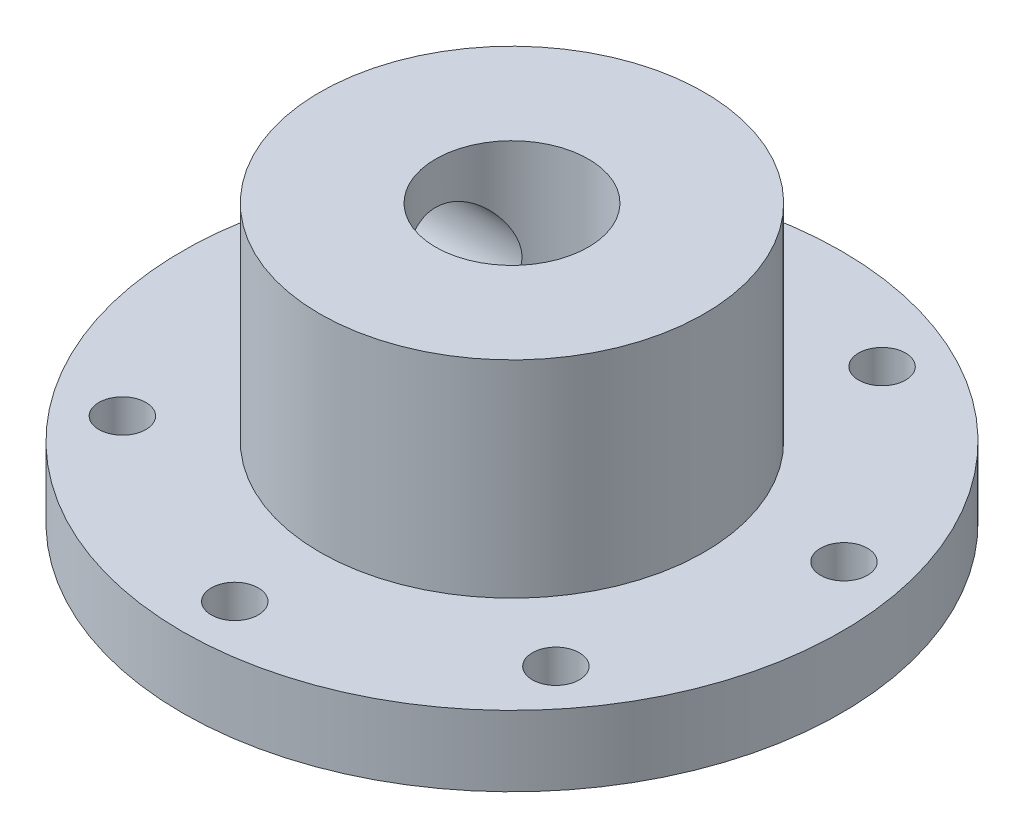
ISO-10303-21;
HEADER;
FILE_DESCRIPTION(('STEP AP214'),'2;1');
FILE_NAME('part.step','',(''),(''),'','','');
FILE_SCHEMA(('AUTOMOTIVE_DESIGN { 1 0 10303 214 1 1 1 1 }'));
ENDSEC;
DATA;
#1=APPLICATION_CONTEXT('core data for automotive mechanical design processes');
#2=APPLICATION_PROTOCOL_DEFINITION('international standard','automotive_design',2000,#1);
#3=PRODUCT_CONTEXT('',#1,'mechanical');
#4=PRODUCT('Part','Part','',(#3));
#5=PRODUCT_RELATED_PRODUCT_CATEGORY('part','',(#4));
#6=PRODUCT_DEFINITION_FORMATION('','',#4);
#7=PRODUCT_DEFINITION_CONTEXT('part definition',#1,'design');
#8=PRODUCT_DEFINITION('design','',#6,#7);
#9=PRODUCT_DEFINITION_SHAPE('','',#8);
#10=(LENGTH_UNIT() NAMED_UNIT(*) SI_UNIT(.MILLI.,.METRE.));
#11=(NAMED_UNIT(*) PLANE_ANGLE_UNIT() SI_UNIT($,.RADIAN.));
#12=(NAMED_UNIT(*) SI_UNIT($,.STERADIAN.) SOLID_ANGLE_UNIT());
#13=UNCERTAINTY_MEASURE_WITH_UNIT(LENGTH_MEASURE(1.E-05),#10,'distance_accuracy_value','');
#14=(GEOMETRIC_REPRESENTATION_CONTEXT(3) GLOBAL_UNCERTAINTY_ASSIGNED_CONTEXT((#13)) GLOBAL_UNIT_ASSIGNED_CONTEXT((#10,
#11,#12)) REPRESENTATION_CONTEXT('',''));
#15=CARTESIAN_POINT('',(0.,0.,0.));
#16=DIRECTION('',(0.,0.,1.));
#17=DIRECTION('',(1.,0.,0.));
#18=AXIS2_PLACEMENT_3D('',#15,#16,#17);
#19=CARTESIAN_POINT('',(0.,-3.,0.));
#20=DIRECTION('',(0.,1.,0.));
#21=DIRECTION('',(0.,0.,1.));
#22=AXIS2_PLACEMENT_3D('',#19,#20,#21);
#23=CYLINDRICAL_SURFACE('',#22,3.25);
#24=CARTESIAN_POINT('',(-2.07665596572952,4.5,-2.5));
#25=CARTESIAN_POINT('',(-2.07664377114661,4.44230656889235,-2.50000566138893));
#26=CARTESIAN_POINT('',(-2.07907132589907,4.38464594428914,-2.49799894449187));
#27=CARTESIAN_POINT('',(-2.08857628107896,4.2699751889259,-2.49005813593567));
#28=CARTESIAN_POINT('',(-2.09565448893797,4.21296517287137,-2.48412336229852));
#29=CARTESIAN_POINT('',(-2.12332760556506,4.04347035146273,-2.46060681756879));
#30=CARTESIAN_POINT('',(-2.15035796263175,3.9327872863159,-2.43731395322061));
#31=CARTESIAN_POINT('',(-2.22332065155218,3.69622867291958,-2.37111624666107));
#32=CARTESIAN_POINT('',(-2.27205819417528,3.572162322965,-2.32508369772081));
#33=CARTESIAN_POINT('',(-2.37836711552942,3.33583969671025,-2.21623158446787));
#34=CARTESIAN_POINT('',(-2.43594946946711,3.22359838946589,-2.15339109096638));
#35=CARTESIAN_POINT('',(-2.55531935086364,3.00823099264308,-2.0104102653358));
#36=CARTESIAN_POINT('',(-2.61717676454373,2.90541146804904,-1.92986856563048));
#37=CARTESIAN_POINT('',(-2.73873311940375,2.71290689253792,-1.75309618091663));
#38=CARTESIAN_POINT('',(-2.7984336200472,2.62321220311639,-1.65687711978355));
#39=CARTESIAN_POINT('',(-2.90898597523917,2.46211711920473,-1.45365132059631));
#40=CARTESIAN_POINT('',(-2.96010882883625,2.39009336569648,-1.34729097062166));
#41=CARTESIAN_POINT('',(-3.05277716606114,2.26194182373479,-1.12155533817299));
#42=CARTESIAN_POINT('',(-3.09433167281294,2.20579904772039,-1.00219247511261));
#43=CARTESIAN_POINT('',(-3.15902364674874,2.11932377530529,-0.771483288222962));
#44=CARTESIAN_POINT('',(-3.18399217521899,2.08637770032506,-0.661636517430967));
#45=CARTESIAN_POINT('',(-3.22256486393462,2.03571566970118,-0.436556061947239));
#46=CARTESIAN_POINT('',(-3.23617629793164,2.01798996582413,-0.32132587513333));
#47=CARTESIAN_POINT('',(-3.25089910438937,1.99882357569063,-0.0883725579162803));
#48=CARTESIAN_POINT('',(-3.25197486513434,1.99742928414114,0.0293567233028187));
#49=CARTESIAN_POINT('',(-3.24143462166312,2.01114138521723,0.263274851593331));
#50=CARTESIAN_POINT('',(-3.22981671840838,2.02625024680077,0.379463465540471));
#51=CARTESIAN_POINT('',(-3.19565973406476,2.07102109387089,0.602002036620541));
#52=CARTESIAN_POINT('',(-3.17360647721204,2.10003636445779,0.708560268431493));
#53=CARTESIAN_POINT('',(-3.12039277546372,2.17085942943099,0.914884653182125));
#54=CARTESIAN_POINT('',(-3.08923024332802,2.21267015578795,1.01464924300416));
#55=CARTESIAN_POINT('',(-3.01603831816756,2.31247602958689,1.21600323619508));
#56=CARTESIAN_POINT('',(-2.97321122037237,2.37171000845147,1.3166832277397));
#57=CARTESIAN_POINT('',(-2.88142020418204,2.50194668096873,1.50701840525063));
#58=CARTESIAN_POINT('',(-2.83245171173749,2.57295815922974,1.59666527421733));
#59=CARTESIAN_POINT('',(-2.72084272270924,2.74068574890235,1.78139727684039));
#60=CARTESIAN_POINT('',(-2.65743634120751,2.83969773627292,1.87393434479637));
#61=CARTESIAN_POINT('',(-2.53057515361085,3.0513694355261,2.04199935019023));
#62=CARTESIAN_POINT('',(-2.46712034738244,3.16403947532975,2.11751429092495));
#63=CARTESIAN_POINT('',(-2.35675235530795,3.38237998737076,2.23914533675759));
#64=CARTESIAN_POINT('',(-2.30886131479316,3.48598187901071,2.28807714029382));
#65=CARTESIAN_POINT('',(-2.22241202121192,3.70226805761061,2.3721333644612));
#66=CARTESIAN_POINT('',(-2.1838328994469,3.81493126698162,2.40728877145923));
#67=CARTESIAN_POINT('',(-2.1294265725795,4.0210628584428,2.45541347065666));
#68=CARTESIAN_POINT('',(-2.11039437623376,4.11289965126335,2.47164140930833));
#69=CARTESIAN_POINT('',(-2.08428691569472,4.29943437775174,2.49370337278068));
#70=CARTESIAN_POINT('',(-2.07719225583911,4.39412741533441,2.49955425868621));
#71=CARTESIAN_POINT('',(-2.07617806639939,4.58384840513162,2.500397238279));
#72=CARTESIAN_POINT('',(-2.08228780684797,4.67887663426021,2.4953652079214));
#73=CARTESIAN_POINT('',(-2.10664457083698,4.86624226052627,2.47483051102712));
#74=CARTESIAN_POINT('',(-2.12491017083724,4.95857531314129,2.45931181832137));
#75=CARTESIAN_POINT('',(-2.17860592174906,5.1688662423269,2.41201674975963));
#76=CARTESIAN_POINT('',(-2.21774017326493,5.2850180258158,2.37653107221683));
#77=CARTESIAN_POINT('',(-2.30601051749137,5.50783464748673,2.29098215123513));
#78=CARTESIAN_POINT('',(-2.35517603720261,5.61447021535544,2.24087582730506));
#79=CARTESIAN_POINT('',(-2.47501088257084,5.85161196994538,2.10882737131452));
#80=CARTESIAN_POINT('',(-2.54743195477295,5.97842378562177,2.02183495151001));
#81=CARTESIAN_POINT('',(-2.69127611061239,6.2143903782872,1.826013507262));
#82=CARTESIAN_POINT('',(-2.76269975485442,6.32355547126647,1.71719732461999));
#83=CARTESIAN_POINT('',(-2.88593091361706,6.50491693551247,1.49893692919333));
#84=CARTESIAN_POINT('',(-2.93900004397812,6.58024246042086,1.39281504139517));
#85=CARTESIAN_POINT('',(-3.03573319612614,6.71480553469745,1.16698238838292));
#86=CARTESIAN_POINT('',(-3.07941169588729,6.77406788673465,1.0472929823899));
#87=CARTESIAN_POINT('',(-3.14774644942291,6.8657089398916,0.816286041518664));
#88=CARTESIAN_POINT('',(-3.17431907153681,6.9008577762242,0.706640714174642));
#89=CARTESIAN_POINT('',(-3.21616878511431,6.95592459915135,0.481494373399203));
#90=CARTESIAN_POINT('',(-3.23145192262106,6.97585073840281,0.365996529730734));
#91=CARTESIAN_POINT('',(-3.24944530244024,6.99929034985627,0.131970597835977));
#92=CARTESIAN_POINT('',(-3.25211478563751,7.00275061533327,0.0134339288411343));
#93=CARTESIAN_POINT('',(-3.24452161107141,6.99287591903065,-0.222516518991301));
#94=CARTESIAN_POINT('',(-3.2342580908212,6.97953983712233,-0.339930222413467));
#95=CARTESIAN_POINT('',(-3.20255868535804,6.93804199406837,-0.564183881170845));
#96=CARTESIAN_POINT('',(-3.18171693706346,6.91066791800391,-0.671257969935062));
#97=CARTESIAN_POINT('',(-3.1307426205262,6.84297759525895,-0.878856329011588));
#98=CARTESIAN_POINT('',(-3.10060789307204,6.80265834069363,-0.9793790705449));
#99=CARTESIAN_POINT('',(-3.02963717423822,6.70621229821096,-1.18168403330284));
#100=CARTESIAN_POINT('',(-2.98804809195258,6.64893383555613,-1.28264782579771));
#101=CARTESIAN_POINT('',(-2.89853696373955,6.52262266259313,-1.47382027818985));
#102=CARTESIAN_POINT('',(-2.85061064167204,6.45358200642853,-1.56402159707781));
#103=CARTESIAN_POINT('',(-2.74113356326524,6.29044422660228,-1.75000511528399));
#104=CARTESIAN_POINT('',(-2.67876862100736,6.19409456674767,-1.84333060121967));
#105=CARTESIAN_POINT('',(-2.55338990024755,5.98796182041094,-2.01341896143868));
#106=CARTESIAN_POINT('',(-2.49037561229501,5.87816731178431,-2.09016759764537));
#107=CARTESIAN_POINT('',(-2.37776984214366,5.66132485917428,-2.21695575771307));
#108=CARTESIAN_POINT('',(-2.32751611012887,5.55591751823214,-2.26920456417323));
#109=CARTESIAN_POINT('',(-2.23614725274306,5.33538453853459,-2.35929159695484));
#110=CARTESIAN_POINT('',(-2.19501575034983,5.22027683610325,-2.3971557364932));
#111=CARTESIAN_POINT('',(-2.13512887087816,5.0047419446912,-2.45051513624481));
#112=CARTESIAN_POINT('',(-2.11357055651646,4.90584638396012,-2.46893688970163));
#113=CARTESIAN_POINT('',(-2.08436183211774,4.70459350558971,-2.4936595558378));
#114=CARTESIAN_POINT('',(-2.07667757716711,4.60224523427514,-2.49998996679473));
#115=CARTESIAN_POINT('',(-2.07665596572952,4.5,-2.5));
#116=B_SPLINE_CURVE_WITH_KNOTS('',3,(#24,#25,#26,#27,#28,#29,#30,#31,#32,#33,#34,#35,#36,#37,
#38,#39,#40,#41,#42,#43,#44,#45,#46,#47,#48,#49,#50,#51,#52,#53,#54,#55,#56,#57,#58,#59,#60,#61,
#62,#63,#64,#65,#66,#67,#68,#69,#70,#71,#72,#73,#74,#75,#76,#77,#78,#79,#80,#81,#82,#83,#84,#85,
#86,#87,#88,#89,#90,#91,#92,#93,#94,#95,#96,#97,#98,#99,#100,#101,#102,#103,#104,#105,#106,#107,
#108,#109,#110,#111,#112,#113,#114,#115),.UNSPECIFIED.,.T.,.F.,(4,2,2,2,2,2,2,2,2,2,2,2,2,2,2,2,
2,2,2,2,2,2,2,2,2,2,2,2,2,2,2,2,2,2,2,2,2,2,2,2,2,2,2,2,2,4),(0.,0.172936252145045,
0.345902536867554,0.692619034854221,1.1134417166606,1.53479086464412,1.96691682334305,
2.39872383104874,2.81185886239185,3.22460268963174,3.57519245111146,3.9255575015476,
4.27691763765995,4.62833034628549,4.96478767425979,5.30132215638939,5.67321233115819,
6.04538114945677,6.49259061269672,6.94014038055584,7.31157320478198,7.68216572675365,
7.96654821462393,8.25046820071391,8.53501819417724,8.82000403562274,9.20068250289278,
9.58249418557861,10.0899669638484,10.5971420004075,11.0171484377808,11.4365026127394,
11.7894987238217,12.1423056517676,12.4962518458463,12.850221645431,13.1862070457998,
13.5222705708273,13.8908359357959,14.2596512766682,14.701803015761,15.1443330278109,
15.5269509114303,15.9088762233409,16.2161071428147,16.5225875735286),.UNSPECIFIED.);
#117=CARTESIAN_POINT('',(-2.07665596572952,4.5,-2.5));
#118=VERTEX_POINT('',#117);
#119=EDGE_CURVE('E56',#118,#118,#116,.T.);
#120=ORIENTED_EDGE('',*,*,#119,.T.);
#121=EDGE_LOOP('',(#120));
#122=FACE_BOUND('',#121,.T.);
#123=CARTESIAN_POINT('',(0.,8.78069169971247,0.));
#124=DIRECTION('',(0.,1.,0.));
#125=DIRECTION('',(0.,0.,1.));
#126=AXIS2_PLACEMENT_3D('',#123,#124,#125);
#127=CIRCLE('',#126,3.25);
#128=CARTESIAN_POINT('',(0.,8.78069169971247,3.25));
#129=VERTEX_POINT('',#128);
#130=EDGE_CURVE('E78',#129,#129,#127,.T.);
#131=ORIENTED_EDGE('',*,*,#130,.T.);
#132=EDGE_LOOP('',(#131));
#133=FACE_BOUND('',#132,.T.);
#134=CARTESIAN_POINT('',(0.,-8.,0.));
#135=DIRECTION('',(0.,-1.,0.));
#136=DIRECTION('',(0.,0.,-1.));
#137=AXIS2_PLACEMENT_3D('',#134,#135,#136);
#138=CIRCLE('',#137,3.25);
#139=CARTESIAN_POINT('',(0.,-8.,-3.25));
#140=VERTEX_POINT('',#139);
#141=EDGE_CURVE('E39',#140,#140,#138,.F.);
#142=ORIENTED_EDGE('',*,*,#141,.F.);
#143=EDGE_LOOP('',(#142));
#144=FACE_BOUND('',#143,.T.);
#145=ADVANCED_FACE('F35',(#122,#133,#144),#23,.F.);
#146=CARTESIAN_POINT('',(0.,-3.,0.));
#147=DIRECTION('',(0.,1.,0.));
#148=DIRECTION('',(0.,0.,1.));
#149=AXIS2_PLACEMENT_3D('',#146,#147,#148);
#150=CYLINDRICAL_SURFACE('',#149,8.175);
#151=CARTESIAN_POINT('',(0.,0.,0.));
#152=DIRECTION('',(0.,1.,0.));
#153=DIRECTION('',(0.,0.,1.));
#154=AXIS2_PLACEMENT_3D('',#151,#152,#153);
#155=CIRCLE('',#154,8.175);
#156=CARTESIAN_POINT('',(0.,0.,8.175));
#157=VERTEX_POINT('',#156);
#158=EDGE_CURVE('E10',#157,#157,#155,.F.);
#159=ORIENTED_EDGE('',*,*,#158,.F.);
#160=EDGE_LOOP('',(#159));
#161=FACE_BOUND('',#160,.T.);
#162=CARTESIAN_POINT('',(-7.78335563879745,4.5,-2.5));
#163=CARTESIAN_POINT('',(-7.78335680540072,4.3631454616449,-2.49999864368084));
#164=CARTESIAN_POINT('',(-7.78700459895127,4.22627747955398,-2.48872431259378));
#165=CARTESIAN_POINT('',(-7.80114050226331,3.95655196733492,-2.44404694645302));
#166=CARTESIAN_POINT('',(-7.81163069443254,3.82369567100182,-2.41063717467594));
#167=CARTESIAN_POINT('',(-7.83815457182935,3.56593826879062,-2.32293665371062));
#168=CARTESIAN_POINT('',(-7.85417876227755,3.44102396854929,-2.26868165123308));
#169=CARTESIAN_POINT('',(-7.88995210565428,3.20203801961637,-2.14094908290259));
#170=CARTESIAN_POINT('',(-7.90970186286477,3.08796813439492,-2.06746839792024));
#171=CARTESIAN_POINT('',(-7.9514295706569,2.87015724707589,-1.9007824690804));
#172=CARTESIAN_POINT('',(-7.97345639372946,2.76682552202142,-1.80705452796226));
#173=CARTESIAN_POINT('',(-8.01683963060632,2.57707451354749,-1.60365405691282));
#174=CARTESIAN_POINT('',(-8.03819595454663,2.49065748907399,-1.4939794007134));
#175=CARTESIAN_POINT('',(-8.07838884868212,2.33539846153209,-1.25887362213221));
#176=CARTESIAN_POINT('',(-8.09716114256476,2.26697568961846,-1.13315369618467));
#177=CARTESIAN_POINT('',(-8.12950169827572,2.15240350772272,-0.871319568235332));
#178=CARTESIAN_POINT('',(-8.14307112855877,2.10624909612884,-0.735207708288681));
#179=CARTESIAN_POINT('',(-8.16313118797637,2.03888379239129,-0.460736867472025));
#180=CARTESIAN_POINT('',(-8.1698197815445,2.0169738748967,-0.322564184529762));
#181=CARTESIAN_POINT('',(-8.17606263148187,1.99650711308639,-0.0443528998674534));
#182=CARTESIAN_POINT('',(-8.17561844300696,1.99794517822589,0.0956852884649465));
#183=CARTESIAN_POINT('',(-8.16778474799891,2.02366865990519,0.368741125747429));
#184=CARTESIAN_POINT('',(-8.16062547345845,2.04719672950409,0.501837773927921));
#185=CARTESIAN_POINT('',(-8.14044738576982,2.11519266616576,0.762094044433502));
#186=CARTESIAN_POINT('',(-8.12742819620966,2.15966187839262,0.889253284789601));
#187=CARTESIAN_POINT('',(-8.09667909544824,2.26877848144273,1.13580106355198));
#188=CARTESIAN_POINT('',(-8.07889485398878,2.33366020066529,1.25507883809877));
#189=CARTESIAN_POINT('',(-8.04049622932406,2.48157351076366,1.48129305088223));
#190=CARTESIAN_POINT('',(-8.01988115448171,2.56460954009578,1.58822646132105));
#191=CARTESIAN_POINT('',(-7.97704856552912,2.75038410933723,1.79123459457927));
#192=CARTESIAN_POINT('',(-7.95479993750081,2.85377776099978,1.88670407118187));
#193=CARTESIAN_POINT('',(-7.91192429621467,3.07532043278802,2.05912437122775));
#194=CARTESIAN_POINT('',(-7.89129745766355,3.19347103906252,2.13607320137611));
#195=CARTESIAN_POINT('',(-7.85384831175156,3.44282079604605,2.26993243307354));
#196=CARTESIAN_POINT('',(-7.83706740695086,3.57414188139436,2.32662813426271));
#197=CARTESIAN_POINT('',(-7.80969869228425,3.84510216246567,2.41691596457875));
#198=CARTESIAN_POINT('',(-7.79910876868344,3.98473850121891,2.4505159797619));
#199=CARTESIAN_POINT('',(-7.78578739228767,4.2625874372721,2.49251063779941));
#200=CARTESIAN_POINT('',(-7.78276828715993,4.40064681359899,2.50182844697182));
#201=CARTESIAN_POINT('',(-7.78413347557899,4.67636288145958,2.49757846871259));
#202=CARTESIAN_POINT('',(-7.78851668385823,4.81401962905948,2.48401403609122));
#203=CARTESIAN_POINT('',(-7.80390952456368,5.08111557952773,2.43520810999258));
#204=CARTESIAN_POINT('',(-7.81473488393949,5.21067653785644,2.40056885225884));
#205=CARTESIAN_POINT('',(-7.84159937311056,5.46213616917907,2.31129889307481));
#206=CARTESIAN_POINT('',(-7.85763932904124,5.5840336244093,2.25666502375598));
#207=CARTESIAN_POINT('',(-7.89367759080795,5.82044052761159,2.12722796192657));
#208=CARTESIAN_POINT('',(-7.91377321928115,5.93465187243109,2.05190809053037));
#209=CARTESIAN_POINT('',(-7.95545300165982,6.14915111432106,1.88384585797596));
#210=CARTESIAN_POINT('',(-7.97703752503093,6.24943553672156,1.79109916247909));
#211=CARTESIAN_POINT('',(-8.02029312524935,6.4373112100638,1.58646308942768));
#212=CARTESIAN_POINT('',(-8.04193404918543,6.52424595614218,1.47396305500842));
#213=CARTESIAN_POINT('',(-8.0820099494997,6.67802367690583,1.2354519984155));
#214=CARTESIAN_POINT('',(-8.1004450799555,6.74486761731269,1.10944162604973));
#215=CARTESIAN_POINT('',(-8.131922731771,6.8559219624732,0.848295968368461));
#216=CARTESIAN_POINT('',(-8.14500490861612,6.90029940689541,0.713236742093906));
#217=CARTESIAN_POINT('',(-8.16447750617903,6.96557324112356,0.437103808133534));
#218=CARTESIAN_POINT('',(-8.17086992364381,6.98647663755605,0.296031908190634));
#219=CARTESIAN_POINT('',(-8.17611623489192,7.00365933892889,0.0179340992148253));
#220=CARTESIAN_POINT('',(-8.1752610673328,7.00088893916845,-0.119028319746653));
#221=CARTESIAN_POINT('',(-8.16679914983415,6.97308654741676,-0.390449706410833));
#222=CARTESIAN_POINT('',(-8.15919280874451,6.94805590350182,-0.524908825209519));
#223=CARTESIAN_POINT('',(-8.13817038131982,6.87703967829414,-0.785989689046117));
#224=CARTESIAN_POINT('',(-8.12482233493206,6.83129918753045,-0.912683957428948));
#225=CARTESIAN_POINT('',(-8.09369485684553,6.72038180898855,-1.15666379214687));
#226=CARTESIAN_POINT('',(-8.07591468158748,6.6552016595412,-1.27394777539006));
#227=CARTESIAN_POINT('',(-8.03705756178529,6.50477181717452,-1.49997363782846));
#228=CARTESIAN_POINT('',(-8.0158914030529,6.41893241820615,-1.60830756364783));
#229=CARTESIAN_POINT('',(-7.972920831796,6.23067258412946,-1.80935001593776));
#230=CARTESIAN_POINT('',(-7.95111623372214,6.12824728868791,-1.90205394588873));
#231=CARTESIAN_POINT('',(-7.90853027677605,5.90587490574889,-2.07212784021014));
#232=CARTESIAN_POINT('',(-7.88780236429631,5.7854794649463,-2.14892652362373));
#233=CARTESIAN_POINT('',(-7.85059900932824,5.5328772359845,-2.28110984458738));
#234=CARTESIAN_POINT('',(-7.83412167136208,5.40067574807804,-2.33650403264647));
#235=CARTESIAN_POINT('',(-7.80878660878785,5.14148294538317,-2.41974866872278));
#236=CARTESIAN_POINT('',(-7.79934274948026,5.01523972624468,-2.44975750884112));
#237=CARTESIAN_POINT('',(-7.78662739295733,4.75933452070684,-2.48988162164049));
#238=CARTESIAN_POINT('',(-7.78335453340998,4.62967329528931,-2.50000128514828));
#239=CARTESIAN_POINT('',(-7.78335563879745,4.5,-2.5));
#240=B_SPLINE_CURVE_WITH_KNOTS('',3,(#162,#163,#164,#165,#166,#167,#168,#169,#170,#171,#172,
#173,#174,#175,#176,#177,#178,#179,#180,#181,#182,#183,#184,#185,#186,#187,#188,#189,#190,#191,
#192,#193,#194,#195,#196,#197,#198,#199,#200,#201,#202,#203,#204,#205,#206,#207,#208,#209,#210,
#211,#212,#213,#214,#215,#216,#217,#218,#219,#220,#221,#222,#223,#224,#225,#226,#227,#228,#229,
#230,#231,#232,#233,#234,#235,#236,#237,#238,#239),.UNSPECIFIED.,.T.,.F.,(4,2,2,2,2,2,2,2,2,2,2,
2,2,2,2,2,2,2,2,2,2,2,2,2,2,2,2,2,2,2,2,2,2,2,2,2,2,2,4),(0.,0.410084966626696,
0.820294796310122,1.22980428974273,1.63938026227062,2.06116584802498,2.48300772456134,
2.91394736669218,3.34479017199661,3.762857995692,4.18083466956834,4.58498498658178,
4.9891612679214,5.39815793052118,5.80725469870665,6.2327112335481,6.65821353793188,
7.0881012914074,7.51784218605782,7.93098934954512,8.344075945982,8.74587896635718,
9.14774567442053,9.56074194896773,9.97384107879664,10.4032306808498,10.8325996397713,
11.2587275233378,11.6847281807353,12.0937115090386,12.502670071073,12.9069104443984,
13.3112186810967,13.7288278828577,14.1465596830711,14.5773765018272,15.0080008710929,
15.3966530351978,15.7852193890085),.UNSPECIFIED.);
#241=CARTESIAN_POINT('',(-7.78335563879745,4.5,-2.5));
#242=VERTEX_POINT('',#241);
#243=EDGE_CURVE('E50',#242,#242,#240,.T.);
#244=ORIENTED_EDGE('',*,*,#243,.F.);
#245=EDGE_LOOP('',(#244));
#246=FACE_BOUND('',#245,.T.);
#247=CARTESIAN_POINT('',(0.,8.78069169971247,0.));
#248=DIRECTION('',(0.,1.,0.));
#249=DIRECTION('',(0.,0.,1.));
#250=AXIS2_PLACEMENT_3D('',#247,#248,#249);
#251=CIRCLE('',#250,8.175);
#252=CARTESIAN_POINT('',(0.,8.78069169971247,8.175));
#253=VERTEX_POINT('',#252);
#254=EDGE_CURVE('E47',#253,#253,#251,.T.);
#255=ORIENTED_EDGE('',*,*,#254,.F.);
#256=EDGE_LOOP('',(#255));
#257=FACE_BOUND('',#256,.T.);
#258=ADVANCED_FACE('F59',(#161,#246,#257),#150,.T.);
#259=CARTESIAN_POINT('',(0.,8.78069169971247,0.));
#260=DIRECTION('',(0.,1.,0.));
#261=DIRECTION('',(0.,0.,1.));
#262=AXIS2_PLACEMENT_3D('',#259,#260,#261);
#263=PLANE('',#262);
#264=ORIENTED_EDGE('',*,*,#130,.F.);
#265=EDGE_LOOP('',(#264));
#266=FACE_BOUND('',#265,.T.);
#267=ORIENTED_EDGE('',*,*,#254,.T.);
#268=EDGE_LOOP('',(#267));
#269=FACE_BOUND('',#268,.T.);
#270=ADVANCED_FACE('F68',(#266,#269),#263,.T.);
#271=CARTESIAN_POINT('',(-15.,4.5,0.));
#272=DIRECTION('',(1.,0.,0.));
#273=DIRECTION('',(0.,0.,-1.));
#274=AXIS2_PLACEMENT_3D('',#271,#272,#273);
#275=CYLINDRICAL_SURFACE('',#274,2.5);
#276=ORIENTED_EDGE('',*,*,#243,.T.);
#277=EDGE_LOOP('',(#276));
#278=FACE_BOUND('',#277,.T.);
#279=ORIENTED_EDGE('',*,*,#119,.F.);
#280=EDGE_LOOP('',(#279));
#281=FACE_BOUND('',#280,.T.);
#282=ADVANCED_FACE('F62',(#278,#281),#275,.F.);
#283=CARTESIAN_POINT('',(0.,-3.,0.));
#284=DIRECTION('',(0.,1.,0.));
#285=DIRECTION('',(0.,0.,1.));
#286=AXIS2_PLACEMENT_3D('',#283,#284,#285);
#287=CYLINDRICAL_SURFACE('',#286,14.02364208937);
#288=CARTESIAN_POINT('',(0.,-3.,0.));
#289=DIRECTION('',(0.,1.,0.));
#290=DIRECTION('',(0.,0.,1.));
#291=AXIS2_PLACEMENT_3D('',#288,#289,#290);
#292=CIRCLE('',#291,14.02364208937);
#293=CARTESIAN_POINT('',(0.,-3.,14.02364208937));
#294=VERTEX_POINT('',#293);
#295=EDGE_CURVE('E147',#294,#294,#292,.T.);
#296=ORIENTED_EDGE('',*,*,#295,.T.);
#297=EDGE_LOOP('',(#296));
#298=FACE_BOUND('',#297,.T.);
#299=CARTESIAN_POINT('',(0.,0.,0.));
#300=DIRECTION('',(0.,1.,0.));
#301=DIRECTION('',(0.,0.,1.));
#302=AXIS2_PLACEMENT_3D('',#299,#300,#301);
#303=CIRCLE('',#302,14.02364208937);
#304=CARTESIAN_POINT('',(0.,0.,14.02364208937));
#305=VERTEX_POINT('',#304);
#306=EDGE_CURVE('E114',#305,#305,#303,.T.);
#307=ORIENTED_EDGE('',*,*,#306,.F.);
#308=EDGE_LOOP('',(#307));
#309=FACE_BOUND('',#308,.T.);
#310=ADVANCED_FACE('F67',(#298,#309),#287,.T.);
#311=CARTESIAN_POINT('',(0.,0.,0.));
#312=DIRECTION('',(0.,1.,0.));
#313=DIRECTION('',(0.,0.,1.));
#314=AXIS2_PLACEMENT_3D('',#311,#312,#313);
#315=PLANE('',#314);
#316=CARTESIAN_POINT('',(0.,0.,11.7973235239983));
#317=DIRECTION('',(0.,1.,0.));
#318=DIRECTION('',(0.,0.,1.));
#319=AXIS2_PLACEMENT_3D('',#316,#317,#318);
#320=CIRCLE('',#319,1.);
#321=CARTESIAN_POINT('',(0.,0.,12.7973235239983));
#322=VERTEX_POINT('',#321);
#323=EDGE_CURVE('E134',#322,#322,#320,.F.);
#324=ORIENTED_EDGE('',*,*,#323,.T.);
#325=EDGE_LOOP('',(#324));
#326=FACE_BOUND('',#325,.T.);
#327=CARTESIAN_POINT('',(9.22351893992257,0.,7.35551090644108));
#328=DIRECTION('',(0.,1.,0.));
#329=DIRECTION('',(0.,0.,1.));
#330=AXIS2_PLACEMENT_3D('',#327,#328,#329);
#331=CIRCLE('',#330,1.);
#332=CARTESIAN_POINT('',(9.22351893992257,0.,8.35551090644108));
#333=VERTEX_POINT('',#332);
#334=EDGE_CURVE('E131',#333,#333,#331,.F.);
#335=ORIENTED_EDGE('',*,*,#334,.T.);
#336=EDGE_LOOP('',(#335));
#337=FACE_BOUND('',#336,.T.);
#338=CARTESIAN_POINT('',(11.5015399925852,0.,-2.6251514487449));
#339=DIRECTION('',(0.,1.,0.));
#340=DIRECTION('',(0.,0.,1.));
#341=AXIS2_PLACEMENT_3D('',#338,#339,#340);
#342=CIRCLE('',#341,1.);
#343=CARTESIAN_POINT('',(11.5015399925852,0.,-1.6251514487449));
#344=VERTEX_POINT('',#343);
#345=EDGE_CURVE('E127',#344,#344,#342,.F.);
#346=ORIENTED_EDGE('',*,*,#345,.T.);
#347=EDGE_LOOP('',(#346));
#348=FACE_BOUND('',#347,.T.);
#349=CARTESIAN_POINT('',(5.11866684217192,0.,-10.6290212196953));
#350=DIRECTION('',(0.,1.,0.));
#351=DIRECTION('',(0.,0.,1.));
#352=AXIS2_PLACEMENT_3D('',#349,#350,#351);
#353=CIRCLE('',#352,1.);
#354=CARTESIAN_POINT('',(5.11866684217192,0.,-9.62902121969534));
#355=VERTEX_POINT('',#354);
#356=EDGE_CURVE('E123',#355,#355,#353,.F.);
#357=ORIENTED_EDGE('',*,*,#356,.T.);
#358=EDGE_LOOP('',(#357));
#359=FACE_BOUND('',#358,.T.);
#360=CARTESIAN_POINT('',(-5.11866684217191,0.,-10.6290212196953));
#361=DIRECTION('',(0.,1.,0.));
#362=DIRECTION('',(0.,0.,1.));
#363=AXIS2_PLACEMENT_3D('',#360,#361,#362);
#364=CIRCLE('',#363,1.);
#365=CARTESIAN_POINT('',(-5.11866684217191,0.,-9.62902121969534));
#366=VERTEX_POINT('',#365);
#367=EDGE_CURVE('E119',#366,#366,#364,.F.);
#368=ORIENTED_EDGE('',*,*,#367,.T.);
#369=EDGE_LOOP('',(#368));
#370=FACE_BOUND('',#369,.T.);
#371=CARTESIAN_POINT('',(-11.5015399925852,0.,-2.62515144874491));
#372=DIRECTION('',(0.,1.,0.));
#373=DIRECTION('',(0.,0.,1.));
#374=AXIS2_PLACEMENT_3D('',#371,#372,#373);
#375=CIRCLE('',#374,1.);
#376=CARTESIAN_POINT('',(-11.5015399925852,0.,-1.6251514487449));
#377=VERTEX_POINT('',#376);
#378=EDGE_CURVE('E110',#377,#377,#375,.F.);
#379=ORIENTED_EDGE('',*,*,#378,.T.);
#380=EDGE_LOOP('',(#379));
#381=FACE_BOUND('',#380,.T.);
#382=CARTESIAN_POINT('',(-9.22351893992256,0.,7.35551090644108));
#383=DIRECTION('',(0.,1.,0.));
#384=DIRECTION('',(0.,0.,1.));
#385=AXIS2_PLACEMENT_3D('',#382,#383,#384);
#386=CIRCLE('',#385,1.);
#387=CARTESIAN_POINT('',(-9.22351893992256,0.,8.35551090644108));
#388=VERTEX_POINT('',#387);
#389=EDGE_CURVE('E103',#388,#388,#386,.F.);
#390=ORIENTED_EDGE('',*,*,#389,.T.);
#391=EDGE_LOOP('',(#390));
#392=FACE_BOUND('',#391,.T.);
#393=ORIENTED_EDGE('',*,*,#158,.T.);
#394=EDGE_LOOP('',(#393));
#395=FACE_BOUND('',#394,.T.);
#396=ORIENTED_EDGE('',*,*,#306,.T.);
#397=EDGE_LOOP('',(#396));
#398=FACE_BOUND('',#397,.T.);
#399=ADVANCED_FACE('F155',(#326,#337,#348,#359,#370,#381,#392,#395,#398),#315,.T.);
#400=CARTESIAN_POINT('',(-9.22351893992256,-6.175,7.35551090644108));
#401=DIRECTION('',(0.,1.,0.));
#402=DIRECTION('',(0.,0.,1.));
#403=AXIS2_PLACEMENT_3D('',#400,#401,#402);
#404=CYLINDRICAL_SURFACE('',#403,1.);
#405=ORIENTED_EDGE('',*,*,#389,.F.);
#406=EDGE_LOOP('',(#405));
#407=FACE_BOUND('',#406,.T.);
#408=CARTESIAN_POINT('',(-9.22351893992256,-3.,7.35551090644108));
#409=DIRECTION('',(0.,1.,0.));
#410=DIRECTION('',(0.,0.,1.));
#411=AXIS2_PLACEMENT_3D('',#408,#409,#410);
#412=CIRCLE('',#411,1.);
#413=CARTESIAN_POINT('',(-9.22351893992256,-3.,8.35551090644108));
#414=VERTEX_POINT('',#413);
#415=EDGE_CURVE('E105',#414,#414,#412,.F.);
#416=ORIENTED_EDGE('',*,*,#415,.T.);
#417=EDGE_LOOP('',(#416));
#418=FACE_BOUND('',#417,.T.);
#419=ADVANCED_FACE('F162',(#407,#418),#404,.F.);
#420=CARTESIAN_POINT('',(-11.5015399925852,-6.175,-2.62515144874491));
#421=DIRECTION('',(0.,1.,0.));
#422=DIRECTION('',(0.,0.,1.));
#423=AXIS2_PLACEMENT_3D('',#420,#421,#422);
#424=CYLINDRICAL_SURFACE('',#423,1.);
#425=ORIENTED_EDGE('',*,*,#378,.F.);
#426=EDGE_LOOP('',(#425));
#427=FACE_BOUND('',#426,.T.);
#428=CARTESIAN_POINT('',(-11.5015399925852,-3.,-2.62515144874491));
#429=DIRECTION('',(0.,1.,0.));
#430=DIRECTION('',(0.,0.,1.));
#431=AXIS2_PLACEMENT_3D('',#428,#429,#430);
#432=CIRCLE('',#431,1.);
#433=CARTESIAN_POINT('',(-11.5015399925852,-3.,-1.6251514487449));
#434=VERTEX_POINT('',#433);
#435=EDGE_CURVE('E118',#434,#434,#432,.F.);
#436=ORIENTED_EDGE('',*,*,#435,.T.);
#437=EDGE_LOOP('',(#436));
#438=FACE_BOUND('',#437,.T.);
#439=ADVANCED_FACE('F203',(#427,#438),#424,.F.);
#440=CARTESIAN_POINT('',(-5.11866684217191,-6.175,-10.6290212196953));
#441=DIRECTION('',(0.,1.,0.));
#442=DIRECTION('',(0.,0.,1.));
#443=AXIS2_PLACEMENT_3D('',#440,#441,#442);
#444=CYLINDRICAL_SURFACE('',#443,1.);
#445=ORIENTED_EDGE('',*,*,#367,.F.);
#446=EDGE_LOOP('',(#445));
#447=FACE_BOUND('',#446,.T.);
#448=CARTESIAN_POINT('',(-5.11866684217191,-3.,-10.6290212196953));
#449=DIRECTION('',(0.,1.,0.));
#450=DIRECTION('',(0.,0.,1.));
#451=AXIS2_PLACEMENT_3D('',#448,#449,#450);
#452=CIRCLE('',#451,1.);
#453=CARTESIAN_POINT('',(-5.11866684217191,-3.,-9.62902121969534));
#454=VERTEX_POINT('',#453);
#455=EDGE_CURVE('E122',#454,#454,#452,.F.);
#456=ORIENTED_EDGE('',*,*,#455,.T.);
#457=EDGE_LOOP('',(#456));
#458=FACE_BOUND('',#457,.T.);
#459=ADVANCED_FACE('F208',(#447,#458),#444,.F.);
#460=CARTESIAN_POINT('',(5.11866684217192,-6.175,-10.6290212196953));
#461=DIRECTION('',(0.,1.,0.));
#462=DIRECTION('',(0.,0.,1.));
#463=AXIS2_PLACEMENT_3D('',#460,#461,#462);
#464=CYLINDRICAL_SURFACE('',#463,1.);
#465=ORIENTED_EDGE('',*,*,#356,.F.);
#466=EDGE_LOOP('',(#465));
#467=FACE_BOUND('',#466,.T.);
#468=CARTESIAN_POINT('',(5.11866684217192,-3.,-10.6290212196953));
#469=DIRECTION('',(0.,1.,0.));
#470=DIRECTION('',(0.,0.,1.));
#471=AXIS2_PLACEMENT_3D('',#468,#469,#470);
#472=CIRCLE('',#471,1.);
#473=CARTESIAN_POINT('',(5.11866684217192,-3.,-9.62902121969534));
#474=VERTEX_POINT('',#473);
#475=EDGE_CURVE('E126',#474,#474,#472,.F.);
#476=ORIENTED_EDGE('',*,*,#475,.T.);
#477=EDGE_LOOP('',(#476));
#478=FACE_BOUND('',#477,.T.);
#479=ADVANCED_FACE('F214',(#467,#478),#464,.F.);
#480=CARTESIAN_POINT('',(11.5015399925852,-6.175,-2.6251514487449));
#481=DIRECTION('',(0.,1.,0.));
#482=DIRECTION('',(0.,0.,1.));
#483=AXIS2_PLACEMENT_3D('',#480,#481,#482);
#484=CYLINDRICAL_SURFACE('',#483,1.);
#485=ORIENTED_EDGE('',*,*,#345,.F.);
#486=EDGE_LOOP('',(#485));
#487=FACE_BOUND('',#486,.T.);
#488=CARTESIAN_POINT('',(11.5015399925852,-3.,-2.6251514487449));
#489=DIRECTION('',(0.,1.,0.));
#490=DIRECTION('',(0.,0.,1.));
#491=AXIS2_PLACEMENT_3D('',#488,#489,#490);
#492=CIRCLE('',#491,1.);
#493=CARTESIAN_POINT('',(11.5015399925852,-3.,-1.6251514487449));
#494=VERTEX_POINT('',#493);
#495=EDGE_CURVE('E130',#494,#494,#492,.F.);
#496=ORIENTED_EDGE('',*,*,#495,.T.);
#497=EDGE_LOOP('',(#496));
#498=FACE_BOUND('',#497,.T.);
#499=ADVANCED_FACE('F218',(#487,#498),#484,.F.);
#500=CARTESIAN_POINT('',(9.22351893992257,-6.175,7.35551090644108));
#501=DIRECTION('',(0.,1.,0.));
#502=DIRECTION('',(0.,0.,1.));
#503=AXIS2_PLACEMENT_3D('',#500,#501,#502);
#504=CYLINDRICAL_SURFACE('',#503,1.);
#505=ORIENTED_EDGE('',*,*,#334,.F.);
#506=EDGE_LOOP('',(#505));
#507=FACE_BOUND('',#506,.T.);
#508=CARTESIAN_POINT('',(9.22351893992257,-3.,7.35551090644108));
#509=DIRECTION('',(0.,1.,0.));
#510=DIRECTION('',(0.,0.,1.));
#511=AXIS2_PLACEMENT_3D('',#508,#509,#510);
#512=CIRCLE('',#511,1.);
#513=CARTESIAN_POINT('',(9.22351893992257,-3.,8.35551090644108));
#514=VERTEX_POINT('',#513);
#515=EDGE_CURVE('E133',#514,#514,#512,.F.);
#516=ORIENTED_EDGE('',*,*,#515,.T.);
#517=EDGE_LOOP('',(#516));
#518=FACE_BOUND('',#517,.T.);
#519=ADVANCED_FACE('F174',(#507,#518),#504,.F.);
#520=CARTESIAN_POINT('',(0.,-6.175,11.7973235239983));
#521=DIRECTION('',(0.,1.,0.));
#522=DIRECTION('',(0.,0.,1.));
#523=AXIS2_PLACEMENT_3D('',#520,#521,#522);
#524=CYLINDRICAL_SURFACE('',#523,1.);
#525=ORIENTED_EDGE('',*,*,#323,.F.);
#526=EDGE_LOOP('',(#525));
#527=FACE_BOUND('',#526,.T.);
#528=CARTESIAN_POINT('',(0.,-3.,11.7973235239983));
#529=DIRECTION('',(0.,1.,0.));
#530=DIRECTION('',(0.,0.,1.));
#531=AXIS2_PLACEMENT_3D('',#528,#529,#530);
#532=CIRCLE('',#531,1.);
#533=CARTESIAN_POINT('',(0.,-3.,12.7973235239983));
#534=VERTEX_POINT('',#533);
#535=EDGE_CURVE('E136',#534,#534,#532,.F.);
#536=ORIENTED_EDGE('',*,*,#535,.T.);
#537=EDGE_LOOP('',(#536));
#538=FACE_BOUND('',#537,.T.);
#539=ADVANCED_FACE('F167',(#527,#538),#524,.F.);
#540=CARTESIAN_POINT('',(0.,-8.,0.));
#541=DIRECTION('',(0.,-1.,0.));
#542=DIRECTION('',(0.,0.,-1.));
#543=AXIS2_PLACEMENT_3D('',#540,#541,#542);
#544=PLANE('',#543);
#545=ORIENTED_EDGE('',*,*,#141,.T.);
#546=EDGE_LOOP('',(#545));
#547=FACE_BOUND('',#546,.T.);
#548=CARTESIAN_POINT('',(0.,-8.,0.));
#549=DIRECTION('',(0.,-1.,0.));
#550=DIRECTION('',(0.,0.,-1.));
#551=AXIS2_PLACEMENT_3D('',#548,#549,#550);
#552=CIRCLE('',#551,4.175);
#553=CARTESIAN_POINT('',(0.,-8.,-4.175));
#554=VERTEX_POINT('',#553);
#555=EDGE_CURVE('E57',#554,#554,#552,.T.);
#556=ORIENTED_EDGE('',*,*,#555,.T.);
#557=EDGE_LOOP('',(#556));
#558=FACE_BOUND('',#557,.T.);
#559=ADVANCED_FACE('F165',(#547,#558),#544,.T.);
#560=CARTESIAN_POINT('',(0.,-8.,0.));
#561=DIRECTION('',(0.,1.,0.));
#562=DIRECTION('',(0.,0.,1.));
#563=AXIS2_PLACEMENT_3D('',#560,#561,#562);
#564=CYLINDRICAL_SURFACE('',#563,4.175);
#565=ORIENTED_EDGE('',*,*,#555,.F.);
#566=EDGE_LOOP('',(#565));
#567=FACE_BOUND('',#566,.T.);
#568=CARTESIAN_POINT('',(0.,-3.,0.));
#569=DIRECTION('',(0.,1.,0.));
#570=DIRECTION('',(0.,0.,1.));
#571=AXIS2_PLACEMENT_3D('',#568,#569,#570);
#572=CIRCLE('',#571,4.175);
#573=CARTESIAN_POINT('',(0.,-3.,4.175));
#574=VERTEX_POINT('',#573);
#575=EDGE_CURVE('E43',#574,#574,#572,.F.);
#576=ORIENTED_EDGE('',*,*,#575,.T.);
#577=EDGE_LOOP('',(#576));
#578=FACE_BOUND('',#577,.T.);
#579=ADVANCED_FACE('F70',(#567,#578),#564,.T.);
#580=CARTESIAN_POINT('',(0.,-3.,0.));
#581=DIRECTION('',(0.,1.,0.));
#582=DIRECTION('',(0.,0.,1.));
#583=AXIS2_PLACEMENT_3D('',#580,#581,#582);
#584=PLANE('',#583);
#585=ORIENTED_EDGE('',*,*,#575,.F.);
#586=EDGE_LOOP('',(#585));
#587=FACE_BOUND('',#586,.T.);
#588=ORIENTED_EDGE('',*,*,#535,.F.);
#589=EDGE_LOOP('',(#588));
#590=FACE_BOUND('',#589,.T.);
#591=ORIENTED_EDGE('',*,*,#515,.F.);
#592=EDGE_LOOP('',(#591));
#593=FACE_BOUND('',#592,.T.);
#594=ORIENTED_EDGE('',*,*,#495,.F.);
#595=EDGE_LOOP('',(#594));
#596=FACE_BOUND('',#595,.T.);
#597=ORIENTED_EDGE('',*,*,#475,.F.);
#598=EDGE_LOOP('',(#597));
#599=FACE_BOUND('',#598,.T.);
#600=ORIENTED_EDGE('',*,*,#455,.F.);
#601=EDGE_LOOP('',(#600));
#602=FACE_BOUND('',#601,.T.);
#603=ORIENTED_EDGE('',*,*,#435,.F.);
#604=EDGE_LOOP('',(#603));
#605=FACE_BOUND('',#604,.T.);
#606=ORIENTED_EDGE('',*,*,#415,.F.);
#607=EDGE_LOOP('',(#606));
#608=FACE_BOUND('',#607,.T.);
#609=ORIENTED_EDGE('',*,*,#295,.F.);
#610=EDGE_LOOP('',(#609));
#611=FACE_BOUND('',#610,.T.);
#612=ADVANCED_FACE('F172',(#587,#590,#593,#596,#599,#602,#605,#608,#611),#584,.F.);
#613=CLOSED_SHELL('',(#145,#258,#270,#282,#310,#399,#419,#439,#459,#479,#499,#519,#539,#559,
#579,#612));
#614=MANIFOLD_SOLID_BREP('B2',#613);
#615=ADVANCED_BREP_SHAPE_REPRESENTATION('',(#18,#614),#14);
#616=SHAPE_DEFINITION_REPRESENTATION(#9,#615);
ENDSEC;
END-ISO-10303-21;
